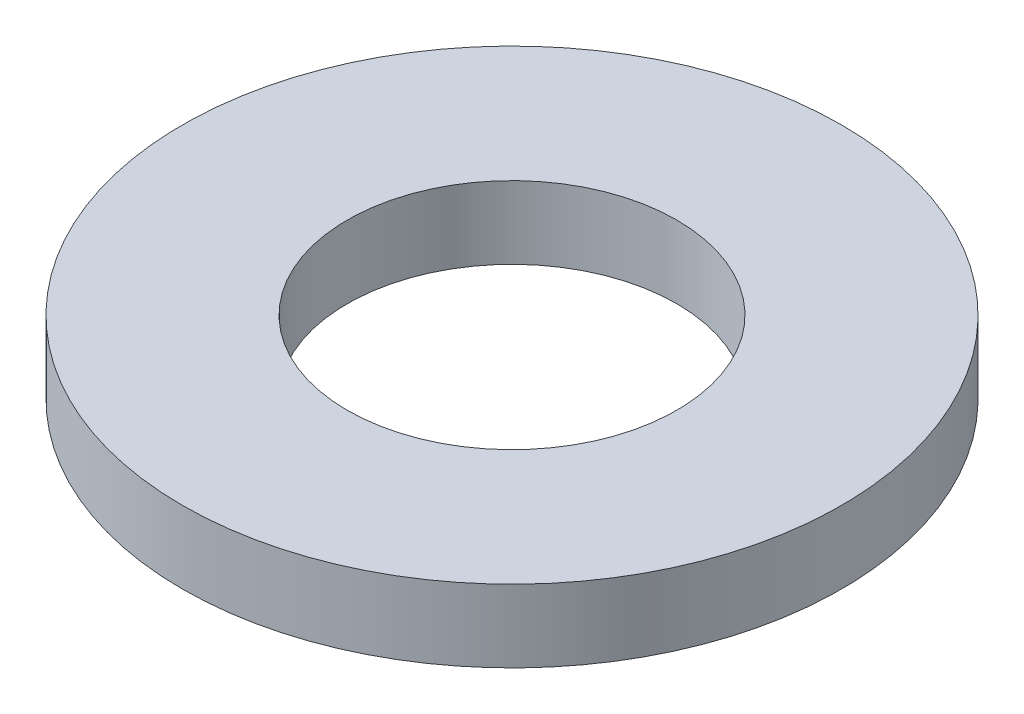
ISO-10303-21;
HEADER;
FILE_DESCRIPTION(('STEP AP214'),'2;1');
FILE_NAME('part.step','',(''),(''),'','','');
FILE_SCHEMA(('AUTOMOTIVE_DESIGN { 1 0 10303 214 1 1 1 1 }'));
ENDSEC;
DATA;
#1=APPLICATION_CONTEXT('core data for automotive mechanical design processes');
#2=APPLICATION_PROTOCOL_DEFINITION('international standard','automotive_design',2000,#1);
#3=PRODUCT_CONTEXT('',#1,'mechanical');
#4=PRODUCT('Part','Part','',(#3));
#5=PRODUCT_RELATED_PRODUCT_CATEGORY('part','',(#4));
#6=PRODUCT_DEFINITION_FORMATION('','',#4);
#7=PRODUCT_DEFINITION_CONTEXT('part definition',#1,'design');
#8=PRODUCT_DEFINITION('design','',#6,#7);
#9=PRODUCT_DEFINITION_SHAPE('','',#8);
#10=(LENGTH_UNIT() NAMED_UNIT(*) SI_UNIT(.MILLI.,.METRE.));
#11=(NAMED_UNIT(*) PLANE_ANGLE_UNIT() SI_UNIT($,.RADIAN.));
#12=(NAMED_UNIT(*) SI_UNIT($,.STERADIAN.) SOLID_ANGLE_UNIT());
#13=UNCERTAINTY_MEASURE_WITH_UNIT(LENGTH_MEASURE(1.E-05),#10,'distance_accuracy_value','');
#14=(GEOMETRIC_REPRESENTATION_CONTEXT(3) GLOBAL_UNCERTAINTY_ASSIGNED_CONTEXT((#13)) GLOBAL_UNIT_ASSIGNED_CONTEXT((#10,
#11,#12)) REPRESENTATION_CONTEXT('',''));
#15=CARTESIAN_POINT('',(0.,0.,0.));
#16=DIRECTION('',(0.,0.,1.));
#17=DIRECTION('',(1.,0.,0.));
#18=AXIS2_PLACEMENT_3D('',#15,#16,#17);
#19=CARTESIAN_POINT('',(0.,1.1,0.));
#20=DIRECTION('',(0.,1.,0.));
#21=DIRECTION('',(1.,0.,0.));
#22=AXIS2_PLACEMENT_3D('',#19,#20,#21);
#23=PLANE('',#22);
#24=CARTESIAN_POINT('',(0.,1.1,0.));
#25=DIRECTION('',(0.,-1.,0.));
#26=DIRECTION('',(0.,0.,1.));
#27=AXIS2_PLACEMENT_3D('',#24,#25,#26);
#28=CIRCLE('',#27,2.5);
#29=CARTESIAN_POINT('',(0.,1.1,-2.5));
#30=VERTEX_POINT('',#29);
#31=EDGE_CURVE('E21',#30,#30,#28,.T.);
#32=ORIENTED_EDGE('',*,*,#31,.T.);
#33=EDGE_LOOP('',(#32));
#34=FACE_BOUND('',#33,.T.);
#35=CARTESIAN_POINT('',(0.,1.1,0.));
#36=DIRECTION('',(0.,-1.,0.));
#37=DIRECTION('',(0.,0.,1.));
#38=AXIS2_PLACEMENT_3D('',#35,#36,#37);
#39=CIRCLE('',#38,5.);
#40=CARTESIAN_POINT('',(0.,1.1,-5.));
#41=VERTEX_POINT('',#40);
#42=EDGE_CURVE('E65',#41,#41,#39,.T.);
#43=ORIENTED_EDGE('',*,*,#42,.F.);
#44=EDGE_LOOP('',(#43));
#45=FACE_BOUND('',#44,.T.);
#46=ADVANCED_FACE('F17',(#34,#45),#23,.T.);
#47=CARTESIAN_POINT('',(0.,0.,0.));
#48=DIRECTION('',(0.,1.,0.));
#49=DIRECTION('',(1.,0.,0.));
#50=AXIS2_PLACEMENT_3D('',#47,#48,#49);
#51=PLANE('',#50);
#52=CARTESIAN_POINT('',(0.,0.,0.));
#53=DIRECTION('',(0.,-1.,0.));
#54=DIRECTION('',(0.,0.,1.));
#55=AXIS2_PLACEMENT_3D('',#52,#53,#54);
#56=CIRCLE('',#55,2.5);
#57=CARTESIAN_POINT('',(0.,0.,-2.5));
#58=VERTEX_POINT('',#57);
#59=EDGE_CURVE('E57',#58,#58,#56,.T.);
#60=ORIENTED_EDGE('',*,*,#59,.F.);
#61=EDGE_LOOP('',(#60));
#62=FACE_BOUND('',#61,.T.);
#63=CARTESIAN_POINT('',(0.,0.,0.));
#64=DIRECTION('',(0.,1.,0.));
#65=DIRECTION('',(0.,0.,1.));
#66=AXIS2_PLACEMENT_3D('',#63,#64,#65);
#67=CIRCLE('',#66,5.);
#68=CARTESIAN_POINT('',(0.,0.,-5.));
#69=VERTEX_POINT('',#68);
#70=EDGE_CURVE('E11',#69,#69,#67,.T.);
#71=ORIENTED_EDGE('',*,*,#70,.F.);
#72=EDGE_LOOP('',(#71));
#73=FACE_BOUND('',#72,.T.);
#74=ADVANCED_FACE('F79',(#62,#73),#51,.F.);
#75=CARTESIAN_POINT('',(0.,0.,0.));
#76=DIRECTION('',(0.,1.,0.));
#77=DIRECTION('',(0.,0.,1.));
#78=AXIS2_PLACEMENT_3D('',#75,#76,#77);
#79=CYLINDRICAL_SURFACE('',#78,5.);
#80=ORIENTED_EDGE('',*,*,#42,.T.);
#81=DIRECTION('',(0.,-1.,0.));
#82=VECTOR('',#81,1.);
#83=CARTESIAN_POINT('',(0.,0.,-5.));
#84=LINE('',#83,#82);
#85=EDGE_CURVE('E28',#41,#69,#84,.T.);
#86=ORIENTED_EDGE('',*,*,#85,.T.);
#87=ORIENTED_EDGE('',*,*,#70,.T.);
#88=ORIENTED_EDGE('',*,*,#85,.F.);
#89=EDGE_LOOP('',(#80,#86,#87,#88));
#90=FACE_BOUND('',#89,.T.);
#91=ADVANCED_FACE('F19',(#90),#79,.T.);
#92=CARTESIAN_POINT('',(0.,0.,0.));
#93=DIRECTION('',(0.,1.,0.));
#94=DIRECTION('',(0.,0.,1.));
#95=AXIS2_PLACEMENT_3D('',#92,#93,#94);
#96=CYLINDRICAL_SURFACE('',#95,2.5);
#97=ORIENTED_EDGE('',*,*,#59,.T.);
#98=DIRECTION('',(0.,1.,0.));
#99=VECTOR('',#98,1.);
#100=CARTESIAN_POINT('',(0.,0.,-2.5));
#101=LINE('',#100,#99);
#102=EDGE_CURVE('E54',#58,#30,#101,.T.);
#103=ORIENTED_EDGE('',*,*,#102,.T.);
#104=ORIENTED_EDGE('',*,*,#31,.F.);
#105=ORIENTED_EDGE('',*,*,#102,.F.);
#106=EDGE_LOOP('',(#97,#103,#104,#105));
#107=FACE_BOUND('',#106,.T.);
#108=ADVANCED_FACE('F55',(#107),#96,.F.);
#109=CLOSED_SHELL('',(#46,#74,#91,#108));
#110=MANIFOLD_SOLID_BREP('B1',#109);
#111=ADVANCED_BREP_SHAPE_REPRESENTATION('',(#18,#110),#14);
#112=SHAPE_DEFINITION_REPRESENTATION(#9,#111);
ENDSEC;
END-ISO-10303-21;
